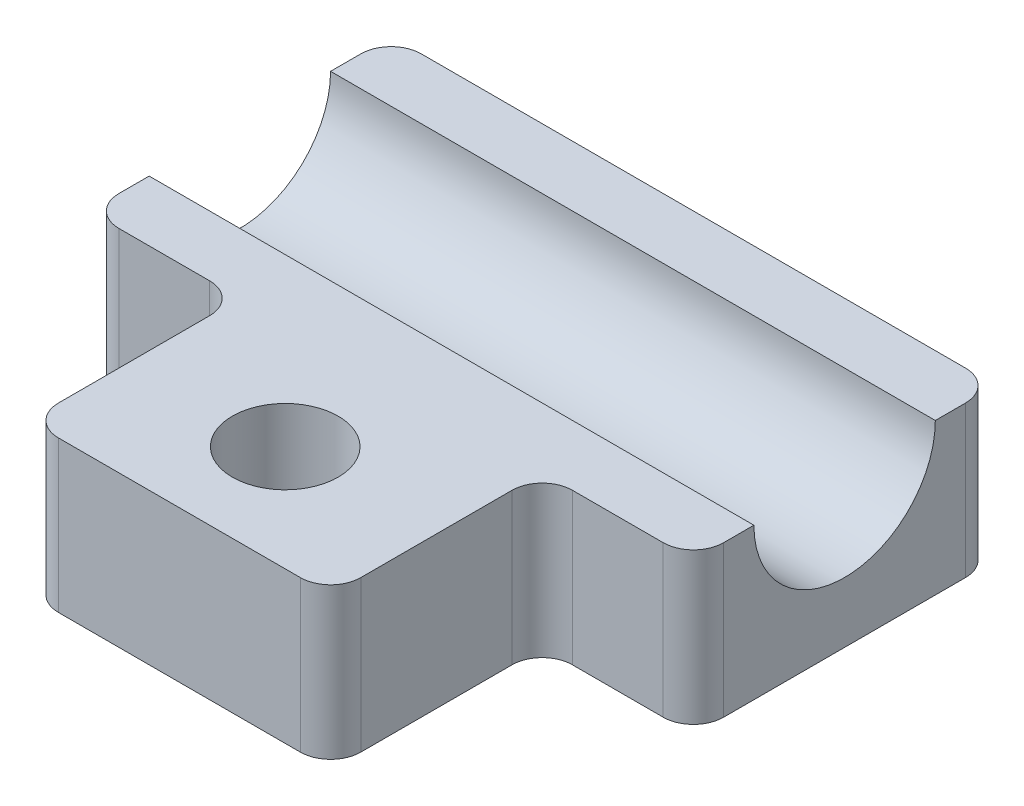
ISO-10303-21;
HEADER;
FILE_DESCRIPTION(('STEP AP214'),'2;1');
FILE_NAME('part.step','',(''),(''),'','','');
FILE_SCHEMA(('AUTOMOTIVE_DESIGN { 1 0 10303 214 1 1 1 1 }'));
ENDSEC;
DATA;
#1=APPLICATION_CONTEXT('core data for automotive mechanical design processes');
#2=APPLICATION_PROTOCOL_DEFINITION('international standard','automotive_design',2000,#1);
#3=PRODUCT_CONTEXT('',#1,'mechanical');
#4=PRODUCT('Part','Part','',(#3));
#5=PRODUCT_RELATED_PRODUCT_CATEGORY('part','',(#4));
#6=PRODUCT_DEFINITION_FORMATION('','',#4);
#7=PRODUCT_DEFINITION_CONTEXT('part definition',#1,'design');
#8=PRODUCT_DEFINITION('design','',#6,#7);
#9=PRODUCT_DEFINITION_SHAPE('','',#8);
#10=(LENGTH_UNIT() NAMED_UNIT(*) SI_UNIT(.MILLI.,.METRE.));
#11=(NAMED_UNIT(*) PLANE_ANGLE_UNIT() SI_UNIT($,.RADIAN.));
#12=(NAMED_UNIT(*) SI_UNIT($,.STERADIAN.) SOLID_ANGLE_UNIT());
#13=UNCERTAINTY_MEASURE_WITH_UNIT(LENGTH_MEASURE(1.E-05),#10,'distance_accuracy_value','');
#14=(GEOMETRIC_REPRESENTATION_CONTEXT(3) GLOBAL_UNCERTAINTY_ASSIGNED_CONTEXT((#13)) GLOBAL_UNIT_ASSIGNED_CONTEXT((#10,
#11,#12)) REPRESENTATION_CONTEXT('',''));
#15=CARTESIAN_POINT('',(0.,0.,0.));
#16=DIRECTION('',(0.,0.,1.));
#17=DIRECTION('',(1.,0.,0.));
#18=AXIS2_PLACEMENT_3D('',#15,#16,#17);
#19=CARTESIAN_POINT('',(0.,10.,0.));
#20=DIRECTION('',(0.,1.,0.));
#21=DIRECTION('',(0.,0.,1.));
#22=AXIS2_PLACEMENT_3D('',#19,#20,#21);
#23=PLANE('',#22);
#24=DIRECTION('',(0.,0.,1.));
#25=VECTOR('',#24,1.);
#26=CARTESIAN_POINT('',(-10.,10.,9.99999999999999));
#27=LINE('',#26,#25);
#28=CARTESIAN_POINT('',(-10.,10.,12.));
#29=VERTEX_POINT('',#28);
#30=CARTESIAN_POINT('',(-10.,10.,22.));
#31=VERTEX_POINT('',#30);
#32=EDGE_CURVE('E203',#29,#31,#27,.T.);
#33=ORIENTED_EDGE('',*,*,#32,.T.);
#34=CARTESIAN_POINT('',(-8.00000000000001,10.,22.));
#35=DIRECTION('',(0.,1.,0.));
#36=DIRECTION('',(0.,0.,1.));
#37=AXIS2_PLACEMENT_3D('',#34,#35,#36);
#38=CIRCLE('',#37,2.);
#39=CARTESIAN_POINT('',(-8.00000000000001,10.,24.));
#40=VERTEX_POINT('',#39);
#41=EDGE_CURVE('E262',#31,#40,#38,.T.);
#42=ORIENTED_EDGE('',*,*,#41,.T.);
#43=DIRECTION('',(1.,0.,0.));
#44=VECTOR('',#43,1.);
#45=CARTESIAN_POINT('',(-10.,10.,24.));
#46=LINE('',#45,#44);
#47=CARTESIAN_POINT('',(8.,10.,24.));
#48=VERTEX_POINT('',#47);
#49=EDGE_CURVE('E205',#40,#48,#46,.T.);
#50=ORIENTED_EDGE('',*,*,#49,.T.);
#51=CARTESIAN_POINT('',(7.99999999999999,10.,22.));
#52=DIRECTION('',(0.,1.,0.));
#53=DIRECTION('',(0.,0.,1.));
#54=AXIS2_PLACEMENT_3D('',#51,#52,#53);
#55=CIRCLE('',#54,2.);
#56=CARTESIAN_POINT('',(9.99999999999999,10.,22.));
#57=VERTEX_POINT('',#56);
#58=EDGE_CURVE('E257',#48,#57,#55,.T.);
#59=ORIENTED_EDGE('',*,*,#58,.T.);
#60=DIRECTION('',(0.,0.,-1.));
#61=VECTOR('',#60,1.);
#62=CARTESIAN_POINT('',(9.99999999999999,10.,9.99999999999999));
#63=LINE('',#62,#61);
#64=CARTESIAN_POINT('',(9.99999999999999,10.,12.));
#65=VERTEX_POINT('',#64);
#66=EDGE_CURVE('E208',#57,#65,#63,.T.);
#67=ORIENTED_EDGE('',*,*,#66,.T.);
#68=CARTESIAN_POINT('',(12.,10.,12.));
#69=DIRECTION('',(0.,1.,0.));
#70=DIRECTION('',(0.,0.,1.));
#71=AXIS2_PLACEMENT_3D('',#68,#69,#70);
#72=CIRCLE('',#71,2.);
#73=CARTESIAN_POINT('',(12.,10.,9.99999999999999));
#74=VERTEX_POINT('',#73);
#75=EDGE_CURVE('E11',#65,#74,#72,.F.);
#76=ORIENTED_EDGE('',*,*,#75,.T.);
#77=DIRECTION('',(1.,0.,0.));
#78=VECTOR('',#77,1.);
#79=CARTESIAN_POINT('',(20.,10.,10.));
#80=LINE('',#79,#78);
#81=CARTESIAN_POINT('',(18.,10.,10.));
#82=VERTEX_POINT('',#81);
#83=EDGE_CURVE('E211',#74,#82,#80,.T.);
#84=ORIENTED_EDGE('',*,*,#83,.T.);
#85=CARTESIAN_POINT('',(18.,10.,8.));
#86=DIRECTION('',(0.,1.,0.));
#87=DIRECTION('',(0.,0.,1.));
#88=AXIS2_PLACEMENT_3D('',#85,#86,#87);
#89=CIRCLE('',#88,2.);
#90=CARTESIAN_POINT('',(20.,10.,8.));
#91=VERTEX_POINT('',#90);
#92=EDGE_CURVE('E169',#82,#91,#89,.T.);
#93=ORIENTED_EDGE('',*,*,#92,.T.);
#94=DIRECTION('',(0.,0.,-1.));
#95=VECTOR('',#94,1.);
#96=CARTESIAN_POINT('',(20.,10.,10.));
#97=LINE('',#96,#95);
#98=CARTESIAN_POINT('',(20.,10.,6.));
#99=VERTEX_POINT('',#98);
#100=EDGE_CURVE('E160',#91,#99,#97,.T.);
#101=ORIENTED_EDGE('',*,*,#100,.T.);
#102=DIRECTION('',(1.,0.,0.));
#103=VECTOR('',#102,1.);
#104=CARTESIAN_POINT('',(-20.,10.,5.99999999999999));
#105=LINE('',#104,#103);
#106=CARTESIAN_POINT('',(-20.,10.,5.99999999999999));
#107=VERTEX_POINT('',#106);
#108=EDGE_CURVE('E165',#107,#99,#105,.T.);
#109=ORIENTED_EDGE('',*,*,#108,.F.);
#110=DIRECTION('',(0.,0.,1.));
#111=VECTOR('',#110,1.);
#112=CARTESIAN_POINT('',(-20.,10.,10.));
#113=LINE('',#112,#111);
#114=CARTESIAN_POINT('',(-20.,10.,8.));
#115=VERTEX_POINT('',#114);
#116=EDGE_CURVE('E200',#107,#115,#113,.T.);
#117=ORIENTED_EDGE('',*,*,#116,.T.);
#118=CARTESIAN_POINT('',(-18.,10.,8.));
#119=DIRECTION('',(0.,1.,0.));
#120=DIRECTION('',(0.,0.,1.));
#121=AXIS2_PLACEMENT_3D('',#118,#119,#120);
#122=CIRCLE('',#121,2.);
#123=CARTESIAN_POINT('',(-18.,10.,10.));
#124=VERTEX_POINT('',#123);
#125=EDGE_CURVE('E260',#115,#124,#122,.T.);
#126=ORIENTED_EDGE('',*,*,#125,.T.);
#127=DIRECTION('',(1.,0.,0.));
#128=VECTOR('',#127,1.);
#129=CARTESIAN_POINT('',(-10.,10.,9.99999999999999));
#130=LINE('',#129,#128);
#131=CARTESIAN_POINT('',(-12.,10.,10.));
#132=VERTEX_POINT('',#131);
#133=EDGE_CURVE('E199',#124,#132,#130,.T.);
#134=ORIENTED_EDGE('',*,*,#133,.T.);
#135=CARTESIAN_POINT('',(-12.,10.,12.));
#136=DIRECTION('',(0.,1.,0.));
#137=DIRECTION('',(0.,0.,1.));
#138=AXIS2_PLACEMENT_3D('',#135,#136,#137);
#139=CIRCLE('',#138,2.);
#140=EDGE_CURVE('E297',#132,#29,#139,.F.);
#141=ORIENTED_EDGE('',*,*,#140,.T.);
#142=EDGE_LOOP('',(#33,#42,#50,#59,#67,#76,#84,#93,#101,#109,#117,#126,#134,#141));
#143=FACE_BOUND('',#142,.T.);
#144=CARTESIAN_POINT('',(0.,10.,17.));
#145=DIRECTION('',(0.,1.,0.));
#146=DIRECTION('',(0.,0.,1.));
#147=AXIS2_PLACEMENT_3D('',#144,#145,#146);
#148=CIRCLE('',#147,3.5);
#149=CARTESIAN_POINT('',(0.,10.,20.5));
#150=VERTEX_POINT('',#149);
#151=EDGE_CURVE('E188',#150,#150,#148,.T.);
#152=ORIENTED_EDGE('',*,*,#151,.F.);
#153=EDGE_LOOP('',(#152));
#154=FACE_BOUND('',#153,.T.);
#155=ADVANCED_FACE('F32',(#143,#154),#23,.T.);
#156=CARTESIAN_POINT('',(-20.,10.,10.));
#157=DIRECTION('',(1.,0.,0.));
#158=DIRECTION('',(0.,0.,-1.));
#159=AXIS2_PLACEMENT_3D('',#156,#157,#158);
#160=PLANE('',#159);
#161=DIRECTION('',(0.,0.,1.));
#162=VECTOR('',#161,1.);
#163=CARTESIAN_POINT('',(-20.,0.,10.));
#164=LINE('',#163,#162);
#165=CARTESIAN_POINT('',(-20.,0.,-7.99999999999999));
#166=VERTEX_POINT('',#165);
#167=CARTESIAN_POINT('',(-20.,0.,8.));
#168=VERTEX_POINT('',#167);
#169=EDGE_CURVE('E194',#166,#168,#164,.T.);
#170=ORIENTED_EDGE('',*,*,#169,.T.);
#171=DIRECTION('',(0.,-1.,0.));
#172=VECTOR('',#171,1.);
#173=CARTESIAN_POINT('',(-20.,10.,8.));
#174=LINE('',#173,#172);
#175=EDGE_CURVE('E272',#168,#115,#174,.F.);
#176=ORIENTED_EDGE('',*,*,#175,.T.);
#177=ORIENTED_EDGE('',*,*,#116,.F.);
#178=CARTESIAN_POINT('',(-20.,10.,0.));
#179=DIRECTION('',(1.,0.,0.));
#180=DIRECTION('',(0.,0.,-1.));
#181=AXIS2_PLACEMENT_3D('',#178,#179,#180);
#182=CIRCLE('',#181,6.);
#183=CARTESIAN_POINT('',(-20.,10.,-6.00000000000001));
#184=VERTEX_POINT('',#183);
#185=EDGE_CURVE('E182',#107,#184,#182,.T.);
#186=ORIENTED_EDGE('',*,*,#185,.T.);
#187=CARTESIAN_POINT('',(-20.,10.,-7.99999999999999));
#188=VERTEX_POINT('',#187);
#189=EDGE_CURVE('E197',#188,#184,#113,.T.);
#190=ORIENTED_EDGE('',*,*,#189,.F.);
#191=DIRECTION('',(0.,-1.,0.));
#192=VECTOR('',#191,1.);
#193=CARTESIAN_POINT('',(-20.,10.,-7.99999999999999));
#194=LINE('',#193,#192);
#195=EDGE_CURVE('E269',#188,#166,#194,.T.);
#196=ORIENTED_EDGE('',*,*,#195,.T.);
#197=EDGE_LOOP('',(#170,#176,#177,#186,#190,#196));
#198=FACE_BOUND('',#197,.T.);
#199=ADVANCED_FACE('F334',(#198),#160,.F.);
#200=CARTESIAN_POINT('',(-10.,10.,9.99999999999999));
#201=DIRECTION('',(0.,0.,-1.));
#202=DIRECTION('',(-1.,0.,0.));
#203=AXIS2_PLACEMENT_3D('',#200,#201,#202);
#204=PLANE('',#203);
#205=DIRECTION('',(1.,0.,0.));
#206=VECTOR('',#205,1.);
#207=CARTESIAN_POINT('',(-10.,0.,9.99999999999999));
#208=LINE('',#207,#206);
#209=CARTESIAN_POINT('',(-18.,0.,10.));
#210=VERTEX_POINT('',#209);
#211=CARTESIAN_POINT('',(-12.,0.,10.));
#212=VERTEX_POINT('',#211);
#213=EDGE_CURVE('E216',#210,#212,#208,.T.);
#214=ORIENTED_EDGE('',*,*,#213,.T.);
#215=DIRECTION('',(0.,-1.,0.));
#216=VECTOR('',#215,1.);
#217=CARTESIAN_POINT('',(-12.,10.,9.99999999999999));
#218=LINE('',#217,#216);
#219=EDGE_CURVE('E267',#212,#132,#218,.F.);
#220=ORIENTED_EDGE('',*,*,#219,.T.);
#221=ORIENTED_EDGE('',*,*,#133,.F.);
#222=DIRECTION('',(0.,-1.,0.));
#223=VECTOR('',#222,1.);
#224=CARTESIAN_POINT('',(-18.,10.,10.));
#225=LINE('',#224,#223);
#226=EDGE_CURVE('E264',#124,#210,#225,.T.);
#227=ORIENTED_EDGE('',*,*,#226,.T.);
#228=EDGE_LOOP('',(#214,#220,#221,#227));
#229=FACE_BOUND('',#228,.T.);
#230=ADVANCED_FACE('F343',(#229),#204,.F.);
#231=CARTESIAN_POINT('',(-10.,10.,9.99999999999999));
#232=DIRECTION('',(1.,0.,0.));
#233=DIRECTION('',(0.,0.,-1.));
#234=AXIS2_PLACEMENT_3D('',#231,#232,#233);
#235=PLANE('',#234);
#236=DIRECTION('',(0.,0.,1.));
#237=VECTOR('',#236,1.);
#238=CARTESIAN_POINT('',(-10.,0.,9.99999999999999));
#239=LINE('',#238,#237);
#240=CARTESIAN_POINT('',(-10.,0.,12.));
#241=VERTEX_POINT('',#240);
#242=CARTESIAN_POINT('',(-10.,0.,22.));
#243=VERTEX_POINT('',#242);
#244=EDGE_CURVE('E219',#241,#243,#239,.T.);
#245=ORIENTED_EDGE('',*,*,#244,.T.);
#246=DIRECTION('',(0.,-1.,0.));
#247=VECTOR('',#246,1.);
#248=CARTESIAN_POINT('',(-10.,10.,22.));
#249=LINE('',#248,#247);
#250=EDGE_CURVE('E255',#243,#31,#249,.F.);
#251=ORIENTED_EDGE('',*,*,#250,.T.);
#252=ORIENTED_EDGE('',*,*,#32,.F.);
#253=DIRECTION('',(0.,-1.,0.));
#254=VECTOR('',#253,1.);
#255=CARTESIAN_POINT('',(-10.,0.,12.));
#256=LINE('',#255,#254);
#257=EDGE_CURVE('E252',#29,#241,#256,.T.);
#258=ORIENTED_EDGE('',*,*,#257,.T.);
#259=EDGE_LOOP('',(#245,#251,#252,#258));
#260=FACE_BOUND('',#259,.T.);
#261=ADVANCED_FACE('F352',(#260),#235,.F.);
#262=CARTESIAN_POINT('',(-10.,10.,24.));
#263=DIRECTION('',(0.,0.,-1.));
#264=DIRECTION('',(-1.,0.,0.));
#265=AXIS2_PLACEMENT_3D('',#262,#263,#264);
#266=PLANE('',#265);
#267=ORIENTED_EDGE('',*,*,#49,.F.);
#268=DIRECTION('',(0.,-1.,0.));
#269=VECTOR('',#268,1.);
#270=CARTESIAN_POINT('',(-8.00000000000001,10.,24.));
#271=LINE('',#270,#269);
#272=CARTESIAN_POINT('',(-8.00000000000001,0.,24.));
#273=VERTEX_POINT('',#272);
#274=EDGE_CURVE('E237',#40,#273,#271,.T.);
#275=ORIENTED_EDGE('',*,*,#274,.T.);
#276=DIRECTION('',(1.,0.,0.));
#277=VECTOR('',#276,1.);
#278=CARTESIAN_POINT('',(-10.,0.,24.));
#279=LINE('',#278,#277);
#280=CARTESIAN_POINT('',(8.,0.,24.));
#281=VERTEX_POINT('',#280);
#282=EDGE_CURVE('E222',#273,#281,#279,.T.);
#283=ORIENTED_EDGE('',*,*,#282,.T.);
#284=DIRECTION('',(0.,-1.,0.));
#285=VECTOR('',#284,1.);
#286=CARTESIAN_POINT('',(8.,10.,24.));
#287=LINE('',#286,#285);
#288=EDGE_CURVE('E183',#281,#48,#287,.F.);
#289=ORIENTED_EDGE('',*,*,#288,.T.);
#290=EDGE_LOOP('',(#267,#275,#283,#289));
#291=FACE_BOUND('',#290,.T.);
#292=ADVANCED_FACE('F360',(#291),#266,.F.);
#293=CARTESIAN_POINT('',(9.99999999999999,10.,9.99999999999999));
#294=DIRECTION('',(-1.,0.,0.));
#295=DIRECTION('',(0.,0.,1.));
#296=AXIS2_PLACEMENT_3D('',#293,#294,#295);
#297=PLANE('',#296);
#298=DIRECTION('',(0.,0.,-1.));
#299=VECTOR('',#298,1.);
#300=CARTESIAN_POINT('',(9.99999999999999,0.,9.99999999999999));
#301=LINE('',#300,#299);
#302=CARTESIAN_POINT('',(9.99999999999999,0.,22.));
#303=VERTEX_POINT('',#302);
#304=CARTESIAN_POINT('',(9.99999999999999,0.,12.));
#305=VERTEX_POINT('',#304);
#306=EDGE_CURVE('E225',#303,#305,#301,.T.);
#307=ORIENTED_EDGE('',*,*,#306,.T.);
#308=DIRECTION('',(0.,-1.,0.));
#309=VECTOR('',#308,1.);
#310=CARTESIAN_POINT('',(9.99999999999999,10.,12.));
#311=LINE('',#310,#309);
#312=EDGE_CURVE('E293',#305,#65,#311,.F.);
#313=ORIENTED_EDGE('',*,*,#312,.T.);
#314=ORIENTED_EDGE('',*,*,#66,.F.);
#315=DIRECTION('',(0.,-1.,0.));
#316=VECTOR('',#315,1.);
#317=CARTESIAN_POINT('',(9.99999999999999,10.,22.));
#318=LINE('',#317,#316);
#319=EDGE_CURVE('E290',#57,#303,#318,.T.);
#320=ORIENTED_EDGE('',*,*,#319,.T.);
#321=EDGE_LOOP('',(#307,#313,#314,#320));
#322=FACE_BOUND('',#321,.T.);
#323=ADVANCED_FACE('F307',(#322),#297,.F.);
#324=CARTESIAN_POINT('',(20.,10.,10.));
#325=DIRECTION('',(0.,0.,-1.));
#326=DIRECTION('',(-1.,0.,0.));
#327=AXIS2_PLACEMENT_3D('',#324,#325,#326);
#328=PLANE('',#327);
#329=DIRECTION('',(1.,0.,0.));
#330=VECTOR('',#329,1.);
#331=CARTESIAN_POINT('',(20.,0.,10.));
#332=LINE('',#331,#330);
#333=CARTESIAN_POINT('',(12.,0.,9.99999999999999));
#334=VERTEX_POINT('',#333);
#335=CARTESIAN_POINT('',(18.,0.,10.));
#336=VERTEX_POINT('',#335);
#337=EDGE_CURVE('E228',#334,#336,#332,.T.);
#338=ORIENTED_EDGE('',*,*,#337,.T.);
#339=DIRECTION('',(0.,-1.,0.));
#340=VECTOR('',#339,1.);
#341=CARTESIAN_POINT('',(18.,10.,10.));
#342=LINE('',#341,#340);
#343=EDGE_CURVE('E288',#336,#82,#342,.F.);
#344=ORIENTED_EDGE('',*,*,#343,.T.);
#345=ORIENTED_EDGE('',*,*,#83,.F.);
#346=DIRECTION('',(0.,-1.,0.));
#347=VECTOR('',#346,1.);
#348=CARTESIAN_POINT('',(12.,0.,9.99999999999999));
#349=LINE('',#348,#347);
#350=EDGE_CURVE('E285',#74,#334,#349,.T.);
#351=ORIENTED_EDGE('',*,*,#350,.T.);
#352=EDGE_LOOP('',(#338,#344,#345,#351));
#353=FACE_BOUND('',#352,.T.);
#354=ADVANCED_FACE('F314',(#353),#328,.F.);
#355=CARTESIAN_POINT('',(20.,10.,10.));
#356=DIRECTION('',(-1.,0.,0.));
#357=DIRECTION('',(0.,0.,1.));
#358=AXIS2_PLACEMENT_3D('',#355,#356,#357);
#359=PLANE('',#358);
#360=DIRECTION('',(0.,0.,-1.));
#361=VECTOR('',#360,1.);
#362=CARTESIAN_POINT('',(20.,0.,10.));
#363=LINE('',#362,#361);
#364=CARTESIAN_POINT('',(20.,0.,8.));
#365=VERTEX_POINT('',#364);
#366=CARTESIAN_POINT('',(20.,0.,-8.));
#367=VERTEX_POINT('',#366);
#368=EDGE_CURVE('E231',#365,#367,#363,.T.);
#369=ORIENTED_EDGE('',*,*,#368,.T.);
#370=DIRECTION('',(0.,-1.,0.));
#371=VECTOR('',#370,1.);
#372=CARTESIAN_POINT('',(20.,10.,-8.));
#373=LINE('',#372,#371);
#374=CARTESIAN_POINT('',(20.,10.,-8.));
#375=VERTEX_POINT('',#374);
#376=EDGE_CURVE('E47',#367,#375,#373,.F.);
#377=ORIENTED_EDGE('',*,*,#376,.T.);
#378=CARTESIAN_POINT('',(20.,10.,-6.));
#379=VERTEX_POINT('',#378);
#380=EDGE_CURVE('E174',#379,#375,#97,.T.);
#381=ORIENTED_EDGE('',*,*,#380,.F.);
#382=CARTESIAN_POINT('',(20.,10.,0.));
#383=DIRECTION('',(1.,0.,0.));
#384=DIRECTION('',(0.,0.,-1.));
#385=AXIS2_PLACEMENT_3D('',#382,#383,#384);
#386=CIRCLE('',#385,6.);
#387=EDGE_CURVE('E179',#99,#379,#386,.T.);
#388=ORIENTED_EDGE('',*,*,#387,.F.);
#389=ORIENTED_EDGE('',*,*,#100,.F.);
#390=DIRECTION('',(0.,-1.,0.));
#391=VECTOR('',#390,1.);
#392=CARTESIAN_POINT('',(20.,10.,8.));
#393=LINE('',#392,#391);
#394=EDGE_CURVE('E282',#91,#365,#393,.T.);
#395=ORIENTED_EDGE('',*,*,#394,.T.);
#396=EDGE_LOOP('',(#369,#377,#381,#388,#389,#395));
#397=FACE_BOUND('',#396,.T.);
#398=ADVANCED_FACE('F186',(#397),#359,.F.);
#399=CARTESIAN_POINT('',(20.,10.,-10.));
#400=DIRECTION('',(0.,0.,1.));
#401=DIRECTION('',(1.,0.,0.));
#402=AXIS2_PLACEMENT_3D('',#399,#400,#401);
#403=PLANE('',#402);
#404=DIRECTION('',(-1.,0.,0.));
#405=VECTOR('',#404,1.);
#406=CARTESIAN_POINT('',(20.,0.,-10.));
#407=LINE('',#406,#405);
#408=CARTESIAN_POINT('',(18.,0.,-10.));
#409=VERTEX_POINT('',#408);
#410=CARTESIAN_POINT('',(-18.,0.,-9.99999999999999));
#411=VERTEX_POINT('',#410);
#412=EDGE_CURVE('E233',#409,#411,#407,.T.);
#413=ORIENTED_EDGE('',*,*,#412,.T.);
#414=DIRECTION('',(0.,-1.,0.));
#415=VECTOR('',#414,1.);
#416=CARTESIAN_POINT('',(-18.,10.,-9.99999999999999));
#417=LINE('',#416,#415);
#418=CARTESIAN_POINT('',(-18.,10.,-9.99999999999999));
#419=VERTEX_POINT('',#418);
#420=EDGE_CURVE('E55',#411,#419,#417,.F.);
#421=ORIENTED_EDGE('',*,*,#420,.T.);
#422=DIRECTION('',(-1.,0.,0.));
#423=VECTOR('',#422,1.);
#424=CARTESIAN_POINT('',(20.,10.,-10.));
#425=LINE('',#424,#423);
#426=CARTESIAN_POINT('',(18.,10.,-10.));
#427=VERTEX_POINT('',#426);
#428=EDGE_CURVE('E173',#427,#419,#425,.T.);
#429=ORIENTED_EDGE('',*,*,#428,.F.);
#430=DIRECTION('',(0.,-1.,0.));
#431=VECTOR('',#430,1.);
#432=CARTESIAN_POINT('',(18.,10.,-10.));
#433=LINE('',#432,#431);
#434=EDGE_CURVE('E274',#427,#409,#433,.T.);
#435=ORIENTED_EDGE('',*,*,#434,.T.);
#436=EDGE_LOOP('',(#413,#421,#429,#435));
#437=FACE_BOUND('',#436,.T.);
#438=ADVANCED_FACE('F324',(#437),#403,.F.);
#439=ORIENTED_EDGE('',*,*,#428,.T.);
#440=CARTESIAN_POINT('',(-18.,10.,-7.99999999999999));
#441=DIRECTION('',(0.,1.,0.));
#442=DIRECTION('',(0.,0.,1.));
#443=AXIS2_PLACEMENT_3D('',#440,#441,#442);
#444=CIRCLE('',#443,2.);
#445=EDGE_CURVE('E280',#419,#188,#444,.T.);
#446=ORIENTED_EDGE('',*,*,#445,.T.);
#447=ORIENTED_EDGE('',*,*,#189,.T.);
#448=DIRECTION('',(1.,0.,0.));
#449=VECTOR('',#448,1.);
#450=CARTESIAN_POINT('',(-20.,10.,-6.00000000000001));
#451=LINE('',#450,#449);
#452=EDGE_CURVE('E184',#379,#184,#451,.F.);
#453=ORIENTED_EDGE('',*,*,#452,.F.);
#454=ORIENTED_EDGE('',*,*,#380,.T.);
#455=CARTESIAN_POINT('',(18.,10.,-8.));
#456=DIRECTION('',(0.,1.,0.));
#457=DIRECTION('',(0.,0.,1.));
#458=AXIS2_PLACEMENT_3D('',#455,#456,#457);
#459=CIRCLE('',#458,2.);
#460=EDGE_CURVE('E278',#375,#427,#459,.T.);
#461=ORIENTED_EDGE('',*,*,#460,.T.);
#462=EDGE_LOOP('',(#439,#446,#447,#453,#454,#461));
#463=FACE_BOUND('',#462,.T.);
#464=ADVANCED_FACE('F327',(#463),#23,.T.);
#465=CARTESIAN_POINT('',(0.,0.,0.));
#466=DIRECTION('',(0.,1.,0.));
#467=DIRECTION('',(0.,0.,1.));
#468=AXIS2_PLACEMENT_3D('',#465,#466,#467);
#469=PLANE('',#468);
#470=CARTESIAN_POINT('',(0.,0.,17.));
#471=DIRECTION('',(0.,1.,0.));
#472=DIRECTION('',(0.,0.,1.));
#473=AXIS2_PLACEMENT_3D('',#470,#471,#472);
#474=CIRCLE('',#473,3.5);
#475=CARTESIAN_POINT('',(0.,0.,20.5));
#476=VERTEX_POINT('',#475);
#477=EDGE_CURVE('E191',#476,#476,#474,.T.);
#478=ORIENTED_EDGE('',*,*,#477,.T.);
#479=EDGE_LOOP('',(#478));
#480=FACE_BOUND('',#479,.T.);
#481=ORIENTED_EDGE('',*,*,#282,.F.);
#482=CARTESIAN_POINT('',(-8.00000000000001,0.,22.));
#483=DIRECTION('',(0.,1.,0.));
#484=DIRECTION('',(0.,0.,1.));
#485=AXIS2_PLACEMENT_3D('',#482,#483,#484);
#486=CIRCLE('',#485,2.);
#487=EDGE_CURVE('E250',#273,#243,#486,.F.);
#488=ORIENTED_EDGE('',*,*,#487,.T.);
#489=ORIENTED_EDGE('',*,*,#244,.F.);
#490=CARTESIAN_POINT('',(-12.,0.,12.));
#491=DIRECTION('',(0.,1.,0.));
#492=DIRECTION('',(0.,0.,1.));
#493=AXIS2_PLACEMENT_3D('',#490,#491,#492);
#494=CIRCLE('',#493,2.);
#495=EDGE_CURVE('E295',#241,#212,#494,.T.);
#496=ORIENTED_EDGE('',*,*,#495,.T.);
#497=ORIENTED_EDGE('',*,*,#213,.F.);
#498=CARTESIAN_POINT('',(-18.,0.,8.));
#499=DIRECTION('',(0.,1.,0.));
#500=DIRECTION('',(0.,0.,1.));
#501=AXIS2_PLACEMENT_3D('',#498,#499,#500);
#502=CIRCLE('',#501,2.);
#503=EDGE_CURVE('E248',#210,#168,#502,.F.);
#504=ORIENTED_EDGE('',*,*,#503,.T.);
#505=ORIENTED_EDGE('',*,*,#169,.F.);
#506=CARTESIAN_POINT('',(-18.,0.,-7.99999999999999));
#507=DIRECTION('',(0.,1.,0.));
#508=DIRECTION('',(0.,0.,1.));
#509=AXIS2_PLACEMENT_3D('',#506,#507,#508);
#510=CIRCLE('',#509,2.);
#511=EDGE_CURVE('E246',#166,#411,#510,.F.);
#512=ORIENTED_EDGE('',*,*,#511,.T.);
#513=ORIENTED_EDGE('',*,*,#412,.F.);
#514=CARTESIAN_POINT('',(18.,0.,-8.));
#515=DIRECTION('',(0.,1.,0.));
#516=DIRECTION('',(0.,0.,1.));
#517=AXIS2_PLACEMENT_3D('',#514,#515,#516);
#518=CIRCLE('',#517,2.);
#519=EDGE_CURVE('E244',#409,#367,#518,.F.);
#520=ORIENTED_EDGE('',*,*,#519,.T.);
#521=ORIENTED_EDGE('',*,*,#368,.F.);
#522=CARTESIAN_POINT('',(18.,0.,8.));
#523=DIRECTION('',(0.,1.,0.));
#524=DIRECTION('',(0.,0.,1.));
#525=AXIS2_PLACEMENT_3D('',#522,#523,#524);
#526=CIRCLE('',#525,2.);
#527=EDGE_CURVE('E242',#365,#336,#526,.F.);
#528=ORIENTED_EDGE('',*,*,#527,.T.);
#529=ORIENTED_EDGE('',*,*,#337,.F.);
#530=CARTESIAN_POINT('',(12.,0.,12.));
#531=DIRECTION('',(0.,1.,0.));
#532=DIRECTION('',(0.,0.,1.));
#533=AXIS2_PLACEMENT_3D('',#530,#531,#532);
#534=CIRCLE('',#533,2.);
#535=EDGE_CURVE('E40',#334,#305,#534,.T.);
#536=ORIENTED_EDGE('',*,*,#535,.T.);
#537=ORIENTED_EDGE('',*,*,#306,.F.);
#538=CARTESIAN_POINT('',(7.99999999999999,0.,22.));
#539=DIRECTION('',(0.,1.,0.));
#540=DIRECTION('',(0.,0.,1.));
#541=AXIS2_PLACEMENT_3D('',#538,#539,#540);
#542=CIRCLE('',#541,2.);
#543=EDGE_CURVE('E240',#303,#281,#542,.F.);
#544=ORIENTED_EDGE('',*,*,#543,.T.);
#545=EDGE_LOOP('',(#481,#488,#489,#496,#497,#504,#505,#512,#513,#520,#521,#528,#529,#536,#537,#544));
#546=FACE_BOUND('',#545,.T.);
#547=ADVANCED_FACE('F302',(#480,#546),#469,.F.);
#548=CARTESIAN_POINT('',(0.,0.,17.));
#549=DIRECTION('',(0.,1.,0.));
#550=DIRECTION('',(0.,0.,1.));
#551=AXIS2_PLACEMENT_3D('',#548,#549,#550);
#552=CYLINDRICAL_SURFACE('',#551,3.5);
#553=ORIENTED_EDGE('',*,*,#477,.F.);
#554=EDGE_LOOP('',(#553));
#555=FACE_BOUND('',#554,.T.);
#556=ORIENTED_EDGE('',*,*,#151,.T.);
#557=EDGE_LOOP('',(#556));
#558=FACE_BOUND('',#557,.T.);
#559=ADVANCED_FACE('F381',(#555,#558),#552,.F.);
#560=CARTESIAN_POINT('',(-20.,10.,0.));
#561=DIRECTION('',(1.,0.,0.));
#562=DIRECTION('',(0.,0.,-1.));
#563=AXIS2_PLACEMENT_3D('',#560,#561,#562);
#564=CYLINDRICAL_SURFACE('',#563,6.);
#565=ORIENTED_EDGE('',*,*,#108,.T.);
#566=ORIENTED_EDGE('',*,*,#387,.T.);
#567=ORIENTED_EDGE('',*,*,#452,.T.);
#568=ORIENTED_EDGE('',*,*,#185,.F.);
#569=EDGE_LOOP('',(#565,#566,#567,#568));
#570=FACE_BOUND('',#569,.T.);
#571=ADVANCED_FACE('F177',(#570),#564,.F.);
#572=CARTESIAN_POINT('',(-8.00000000000001,10.,22.));
#573=DIRECTION('',(0.,-1.,0.));
#574=DIRECTION('',(0.,0.,-1.));
#575=AXIS2_PLACEMENT_3D('',#572,#573,#574);
#576=CYLINDRICAL_SURFACE('',#575,2.);
#577=ORIENTED_EDGE('',*,*,#41,.F.);
#578=ORIENTED_EDGE('',*,*,#250,.F.);
#579=ORIENTED_EDGE('',*,*,#487,.F.);
#580=ORIENTED_EDGE('',*,*,#274,.F.);
#581=EDGE_LOOP('',(#577,#578,#579,#580));
#582=FACE_BOUND('',#581,.T.);
#583=ADVANCED_FACE('F357',(#582),#576,.T.);
#584=CARTESIAN_POINT('',(-12.,10.,12.));
#585=DIRECTION('',(0.,1.,0.));
#586=DIRECTION('',(0.,0.,1.));
#587=AXIS2_PLACEMENT_3D('',#584,#585,#586);
#588=CYLINDRICAL_SURFACE('',#587,2.);
#589=ORIENTED_EDGE('',*,*,#140,.F.);
#590=ORIENTED_EDGE('',*,*,#219,.F.);
#591=ORIENTED_EDGE('',*,*,#495,.F.);
#592=ORIENTED_EDGE('',*,*,#257,.F.);
#593=EDGE_LOOP('',(#589,#590,#591,#592));
#594=FACE_BOUND('',#593,.T.);
#595=ADVANCED_FACE('F349',(#594),#588,.F.);
#596=CARTESIAN_POINT('',(-18.,10.,8.));
#597=DIRECTION('',(0.,-1.,0.));
#598=DIRECTION('',(0.,0.,-1.));
#599=AXIS2_PLACEMENT_3D('',#596,#597,#598);
#600=CYLINDRICAL_SURFACE('',#599,2.);
#601=ORIENTED_EDGE('',*,*,#125,.F.);
#602=ORIENTED_EDGE('',*,*,#175,.F.);
#603=ORIENTED_EDGE('',*,*,#503,.F.);
#604=ORIENTED_EDGE('',*,*,#226,.F.);
#605=EDGE_LOOP('',(#601,#602,#603,#604));
#606=FACE_BOUND('',#605,.T.);
#607=ADVANCED_FACE('F340',(#606),#600,.T.);
#608=CARTESIAN_POINT('',(-18.,10.,-7.99999999999999));
#609=DIRECTION('',(0.,-1.,0.));
#610=DIRECTION('',(0.,0.,-1.));
#611=AXIS2_PLACEMENT_3D('',#608,#609,#610);
#612=CYLINDRICAL_SURFACE('',#611,2.);
#613=ORIENTED_EDGE('',*,*,#445,.F.);
#614=ORIENTED_EDGE('',*,*,#420,.F.);
#615=ORIENTED_EDGE('',*,*,#511,.F.);
#616=ORIENTED_EDGE('',*,*,#195,.F.);
#617=EDGE_LOOP('',(#613,#614,#615,#616));
#618=FACE_BOUND('',#617,.T.);
#619=ADVANCED_FACE('F331',(#618),#612,.T.);
#620=CARTESIAN_POINT('',(18.,10.,-8.));
#621=DIRECTION('',(0.,-1.,0.));
#622=DIRECTION('',(0.,0.,-1.));
#623=AXIS2_PLACEMENT_3D('',#620,#621,#622);
#624=CYLINDRICAL_SURFACE('',#623,2.);
#625=ORIENTED_EDGE('',*,*,#460,.F.);
#626=ORIENTED_EDGE('',*,*,#376,.F.);
#627=ORIENTED_EDGE('',*,*,#519,.F.);
#628=ORIENTED_EDGE('',*,*,#434,.F.);
#629=EDGE_LOOP('',(#625,#626,#627,#628));
#630=FACE_BOUND('',#629,.T.);
#631=ADVANCED_FACE('F323',(#630),#624,.T.);
#632=CARTESIAN_POINT('',(18.,10.,8.));
#633=DIRECTION('',(0.,-1.,0.));
#634=DIRECTION('',(0.,0.,-1.));
#635=AXIS2_PLACEMENT_3D('',#632,#633,#634);
#636=CYLINDRICAL_SURFACE('',#635,2.);
#637=ORIENTED_EDGE('',*,*,#92,.F.);
#638=ORIENTED_EDGE('',*,*,#343,.F.);
#639=ORIENTED_EDGE('',*,*,#527,.F.);
#640=ORIENTED_EDGE('',*,*,#394,.F.);
#641=EDGE_LOOP('',(#637,#638,#639,#640));
#642=FACE_BOUND('',#641,.T.);
#643=ADVANCED_FACE('F317',(#642),#636,.T.);
#644=CARTESIAN_POINT('',(12.,10.,12.));
#645=DIRECTION('',(0.,1.,0.));
#646=DIRECTION('',(0.,0.,1.));
#647=AXIS2_PLACEMENT_3D('',#644,#645,#646);
#648=CYLINDRICAL_SURFACE('',#647,2.);
#649=ORIENTED_EDGE('',*,*,#75,.F.);
#650=ORIENTED_EDGE('',*,*,#312,.F.);
#651=ORIENTED_EDGE('',*,*,#535,.F.);
#652=ORIENTED_EDGE('',*,*,#350,.F.);
#653=EDGE_LOOP('',(#649,#650,#651,#652));
#654=FACE_BOUND('',#653,.T.);
#655=ADVANCED_FACE('F311',(#654),#648,.F.);
#656=CARTESIAN_POINT('',(7.99999999999999,10.,22.));
#657=DIRECTION('',(0.,-1.,0.));
#658=DIRECTION('',(0.,0.,-1.));
#659=AXIS2_PLACEMENT_3D('',#656,#657,#658);
#660=CYLINDRICAL_SURFACE('',#659,2.);
#661=ORIENTED_EDGE('',*,*,#58,.F.);
#662=ORIENTED_EDGE('',*,*,#288,.F.);
#663=ORIENTED_EDGE('',*,*,#543,.F.);
#664=ORIENTED_EDGE('',*,*,#319,.F.);
#665=EDGE_LOOP('',(#661,#662,#663,#664));
#666=FACE_BOUND('',#665,.T.);
#667=ADVANCED_FACE('F34',(#666),#660,.T.);
#668=CLOSED_SHELL('',(#155,#199,#230,#261,#292,#323,#354,#398,#438,#464,#547,#559,#571,#583,
#595,#607,#619,#631,#643,#655,#667));
#669=MANIFOLD_SOLID_BREP('B2',#668);
#670=ADVANCED_BREP_SHAPE_REPRESENTATION('',(#18,#669),#14);
#671=SHAPE_DEFINITION_REPRESENTATION(#9,#670);
ENDSEC;
END-ISO-10303-21;
